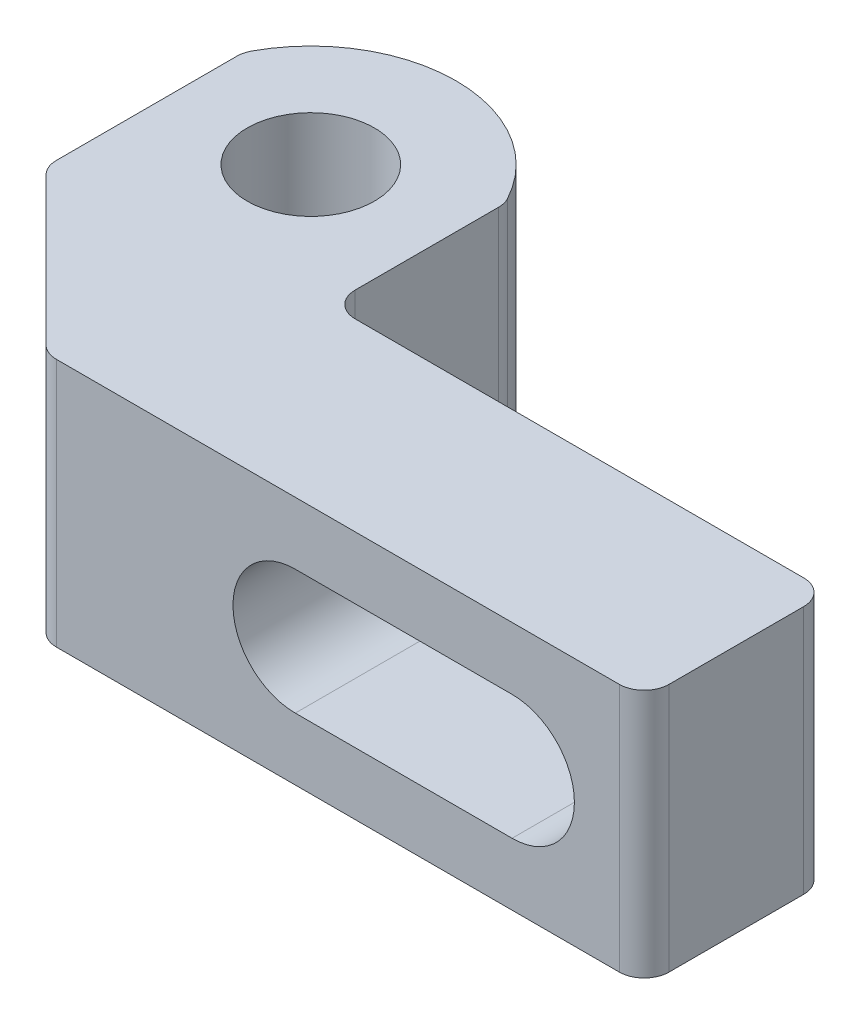
ISO-10303-21;
HEADER;
FILE_DESCRIPTION(('STEP AP214'),'2;1');
FILE_NAME('part.step','',(''),(''),'','','');
FILE_SCHEMA(('AUTOMOTIVE_DESIGN { 1 0 10303 214 1 1 1 1 }'));
ENDSEC;
DATA;
#1=APPLICATION_CONTEXT('core data for automotive mechanical design processes');
#2=APPLICATION_PROTOCOL_DEFINITION('international standard','automotive_design',2000,#1);
#3=PRODUCT_CONTEXT('',#1,'mechanical');
#4=PRODUCT('Part','Part','',(#3));
#5=PRODUCT_RELATED_PRODUCT_CATEGORY('part','',(#4));
#6=PRODUCT_DEFINITION_FORMATION('','',#4);
#7=PRODUCT_DEFINITION_CONTEXT('part definition',#1,'design');
#8=PRODUCT_DEFINITION('design','',#6,#7);
#9=PRODUCT_DEFINITION_SHAPE('','',#8);
#10=(LENGTH_UNIT() NAMED_UNIT(*) SI_UNIT(.MILLI.,.METRE.));
#11=(NAMED_UNIT(*) PLANE_ANGLE_UNIT() SI_UNIT($,.RADIAN.));
#12=(NAMED_UNIT(*) SI_UNIT($,.STERADIAN.) SOLID_ANGLE_UNIT());
#13=UNCERTAINTY_MEASURE_WITH_UNIT(LENGTH_MEASURE(1.E-05),#10,'distance_accuracy_value','');
#14=(GEOMETRIC_REPRESENTATION_CONTEXT(3) GLOBAL_UNCERTAINTY_ASSIGNED_CONTEXT((#13)) GLOBAL_UNIT_ASSIGNED_CONTEXT((#10,
#11,#12)) REPRESENTATION_CONTEXT('',''));
#15=CARTESIAN_POINT('',(0.,0.,0.));
#16=DIRECTION('',(0.,0.,1.));
#17=DIRECTION('',(1.,0.,0.));
#18=AXIS2_PLACEMENT_3D('',#15,#16,#17);
#19=CARTESIAN_POINT('',(-25.25,10.,-11.8738636363636));
#20=DIRECTION('',(0.,-1.,0.));
#21=DIRECTION('',(0.,0.,-1.));
#22=AXIS2_PLACEMENT_3D('',#19,#20,#21);
#23=PLANE('',#22);
#24=DIRECTION('',(0.707106781186546,0.,0.707106781186549));
#25=VECTOR('',#24,1.);
#26=CARTESIAN_POINT('',(-24.,10.,0.));
#27=LINE('',#26,#25);
#28=CARTESIAN_POINT('',(-30.2071067811865,10.,-6.20710678118656));
#29=VERTEX_POINT('',#28);
#30=CARTESIAN_POINT('',(-24.2928932188135,10.,-0.29289321881345));
#31=VERTEX_POINT('',#30);
#32=EDGE_CURVE('E226',#29,#31,#27,.T.);
#33=ORIENTED_EDGE('',*,*,#32,.T.);
#34=CARTESIAN_POINT('',(-23.5857864376269,10.,-0.999999999999997));
#35=DIRECTION('',(0.,-1.,0.));
#36=DIRECTION('',(0.,0.,-1.));
#37=AXIS2_PLACEMENT_3D('',#34,#35,#36);
#38=CIRCLE('',#37,1.);
#39=CARTESIAN_POINT('',(-23.5857864376269,10.,0.));
#40=VERTEX_POINT('',#39);
#41=EDGE_CURVE('E278',#31,#40,#38,.F.);
#42=ORIENTED_EDGE('',*,*,#41,.T.);
#43=DIRECTION('',(1.,0.,0.));
#44=VECTOR('',#43,1.);
#45=CARTESIAN_POINT('',(0.,10.,0.));
#46=LINE('',#45,#44);
#47=CARTESIAN_POINT('',(-1.,10.,0.));
#48=VERTEX_POINT('',#47);
#49=EDGE_CURVE('E209',#40,#48,#46,.T.);
#50=ORIENTED_EDGE('',*,*,#49,.T.);
#51=CARTESIAN_POINT('',(-1.,10.,-1.));
#52=DIRECTION('',(0.,-1.,0.));
#53=DIRECTION('',(0.,0.,-1.));
#54=AXIS2_PLACEMENT_3D('',#51,#52,#53);
#55=CIRCLE('',#54,1.);
#56=CARTESIAN_POINT('',(0.,10.,-1.));
#57=VERTEX_POINT('',#56);
#58=EDGE_CURVE('E269',#48,#57,#55,.F.);
#59=ORIENTED_EDGE('',*,*,#58,.T.);
#60=DIRECTION('',(0.,0.,-1.));
#61=VECTOR('',#60,1.);
#62=CARTESIAN_POINT('',(0.,10.,0.));
#63=LINE('',#62,#61);
#64=CARTESIAN_POINT('',(0.,10.,-6.4));
#65=VERTEX_POINT('',#64);
#66=EDGE_CURVE('E212',#57,#65,#63,.T.);
#67=ORIENTED_EDGE('',*,*,#66,.T.);
#68=CARTESIAN_POINT('',(-1.,10.,-6.4));
#69=DIRECTION('',(0.,-1.,0.));
#70=DIRECTION('',(0.,0.,-1.));
#71=AXIS2_PLACEMENT_3D('',#68,#69,#70);
#72=CIRCLE('',#71,1.);
#73=CARTESIAN_POINT('',(-1.,10.,-7.4));
#74=VERTEX_POINT('',#73);
#75=EDGE_CURVE('E271',#65,#74,#72,.F.);
#76=ORIENTED_EDGE('',*,*,#75,.T.);
#77=DIRECTION('',(-1.,0.,0.));
#78=VECTOR('',#77,1.);
#79=CARTESIAN_POINT('',(0.,10.,-7.4));
#80=LINE('',#79,#78);
#81=CARTESIAN_POINT('',(-19.,10.,-7.4));
#82=VERTEX_POINT('',#81);
#83=EDGE_CURVE('E216',#74,#82,#80,.T.);
#84=ORIENTED_EDGE('',*,*,#83,.T.);
#85=CARTESIAN_POINT('',(-19.,10.,-8.4));
#86=DIRECTION('',(0.,-1.,0.));
#87=DIRECTION('',(0.,0.,-1.));
#88=AXIS2_PLACEMENT_3D('',#85,#86,#87);
#89=CIRCLE('',#88,1.);
#90=CARTESIAN_POINT('',(-20.,10.,-8.4));
#91=VERTEX_POINT('',#90);
#92=EDGE_CURVE('E11',#82,#91,#89,.T.);
#93=ORIENTED_EDGE('',*,*,#92,.T.);
#94=DIRECTION('',(0.,0.,-1.));
#95=VECTOR('',#94,1.);
#96=CARTESIAN_POINT('',(-20.,10.,-7.4));
#97=LINE('',#96,#95);
#98=CARTESIAN_POINT('',(-20.,10.,-14.1605844764342));
#99=VERTEX_POINT('',#98);
#100=EDGE_CURVE('E219',#91,#99,#97,.T.);
#101=ORIENTED_EDGE('',*,*,#100,.T.);
#102=CARTESIAN_POINT('',(-21.,10.,-14.1605844764342));
#103=DIRECTION('',(0.,-1.,0.));
#104=DIRECTION('',(0.,0.,-1.));
#105=AXIS2_PLACEMENT_3D('',#102,#103,#104);
#106=CIRCLE('',#105,1.);
#107=CARTESIAN_POINT('',(-20.1193783847422,10.,-14.6344046646288));
#108=VERTEX_POINT('',#107);
#109=EDGE_CURVE('E273',#99,#108,#106,.F.);
#110=ORIENTED_EDGE('',*,*,#109,.T.);
#111=CARTESIAN_POINT('',(-25.25,10.,-11.8738636363636));
#112=DIRECTION('',(0.,1.,0.));
#113=DIRECTION('',(0.,0.,-1.));
#114=AXIS2_PLACEMENT_3D('',#111,#112,#113);
#115=CIRCLE('',#114,5.82613636363636);
#116=CARTESIAN_POINT('',(-30.3806216152578,10.,-14.6344046646288));
#117=VERTEX_POINT('',#116);
#118=EDGE_CURVE('E222',#108,#117,#115,.T.);
#119=ORIENTED_EDGE('',*,*,#118,.T.);
#120=CARTESIAN_POINT('',(-29.5,10.,-14.1605844764342));
#121=DIRECTION('',(0.,-1.,0.));
#122=DIRECTION('',(0.,0.,-1.));
#123=AXIS2_PLACEMENT_3D('',#120,#121,#122);
#124=CIRCLE('',#123,1.);
#125=CARTESIAN_POINT('',(-30.5,10.,-14.1605844764342));
#126=VERTEX_POINT('',#125);
#127=EDGE_CURVE('E55',#117,#126,#124,.F.);
#128=ORIENTED_EDGE('',*,*,#127,.T.);
#129=DIRECTION('',(0.,0.,1.));
#130=VECTOR('',#129,1.);
#131=CARTESIAN_POINT('',(-30.5,10.,-6.50000000000002));
#132=LINE('',#131,#130);
#133=CARTESIAN_POINT('',(-30.5,10.,-6.91421356237311));
#134=VERTEX_POINT('',#133);
#135=EDGE_CURVE('E224',#126,#134,#132,.T.);
#136=ORIENTED_EDGE('',*,*,#135,.T.);
#137=CARTESIAN_POINT('',(-29.5,10.,-6.91421356237311));
#138=DIRECTION('',(0.,-1.,0.));
#139=DIRECTION('',(0.,0.,-1.));
#140=AXIS2_PLACEMENT_3D('',#137,#138,#139);
#141=CIRCLE('',#140,1.);
#142=EDGE_CURVE('E276',#134,#29,#141,.F.);
#143=ORIENTED_EDGE('',*,*,#142,.T.);
#144=EDGE_LOOP('',(#33,#42,#50,#59,#67,#76,#84,#93,#101,#110,#119,#128,#136,#143));
#145=FACE_BOUND('',#144,.T.);
#146=CARTESIAN_POINT('',(-25.25,10.,-11.8738636363636));
#147=DIRECTION('',(0.,1.,0.));
#148=DIRECTION('',(0.,0.,1.));
#149=AXIS2_PLACEMENT_3D('',#146,#147,#148);
#150=CIRCLE('',#149,2.55);
#151=CARTESIAN_POINT('',(-25.25,10.,-9.32386363636364));
#152=VERTEX_POINT('',#151);
#153=EDGE_CURVE('E203',#152,#152,#150,.T.);
#154=ORIENTED_EDGE('',*,*,#153,.F.);
#155=EDGE_LOOP('',(#154));
#156=FACE_BOUND('',#155,.T.);
#157=ADVANCED_FACE('F33',(#145,#156),#23,.F.);
#158=CARTESIAN_POINT('',(-25.25,0.,-11.8738636363636));
#159=DIRECTION('',(0.,-1.,0.));
#160=DIRECTION('',(0.,0.,-1.));
#161=AXIS2_PLACEMENT_3D('',#158,#159,#160);
#162=PLANE('',#161);
#163=DIRECTION('',(1.,0.,0.));
#164=VECTOR('',#163,1.);
#165=CARTESIAN_POINT('',(0.,0.,0.));
#166=LINE('',#165,#164);
#167=CARTESIAN_POINT('',(-23.5857864376269,0.,0.));
#168=VERTEX_POINT('',#167);
#169=CARTESIAN_POINT('',(-1.,0.,0.));
#170=VERTEX_POINT('',#169);
#171=EDGE_CURVE('E206',#168,#170,#166,.T.);
#172=ORIENTED_EDGE('',*,*,#171,.F.);
#173=CARTESIAN_POINT('',(-23.5857864376269,0.,-0.999999999999997));
#174=DIRECTION('',(0.,-1.,0.));
#175=DIRECTION('',(0.,0.,-1.));
#176=AXIS2_PLACEMENT_3D('',#173,#174,#175);
#177=CIRCLE('',#176,1.);
#178=CARTESIAN_POINT('',(-24.2928932188135,0.,-0.29289321881345));
#179=VERTEX_POINT('',#178);
#180=EDGE_CURVE('E262',#168,#179,#177,.T.);
#181=ORIENTED_EDGE('',*,*,#180,.T.);
#182=DIRECTION('',(0.707106781186546,0.,0.707106781186549));
#183=VECTOR('',#182,1.);
#184=CARTESIAN_POINT('',(-24.,0.,0.));
#185=LINE('',#184,#183);
#186=CARTESIAN_POINT('',(-30.2071067811865,0.,-6.20710678118656));
#187=VERTEX_POINT('',#186);
#188=EDGE_CURVE('E213',#187,#179,#185,.T.);
#189=ORIENTED_EDGE('',*,*,#188,.F.);
#190=CARTESIAN_POINT('',(-29.5,0.,-6.91421356237311));
#191=DIRECTION('',(0.,-1.,0.));
#192=DIRECTION('',(0.,0.,-1.));
#193=AXIS2_PLACEMENT_3D('',#190,#191,#192);
#194=CIRCLE('',#193,1.);
#195=CARTESIAN_POINT('',(-30.5,0.,-6.91421356237311));
#196=VERTEX_POINT('',#195);
#197=EDGE_CURVE('E260',#187,#196,#194,.T.);
#198=ORIENTED_EDGE('',*,*,#197,.T.);
#199=DIRECTION('',(0.,0.,1.));
#200=VECTOR('',#199,1.);
#201=CARTESIAN_POINT('',(-30.5,0.,-6.50000000000002));
#202=LINE('',#201,#200);
#203=CARTESIAN_POINT('',(-30.5,0.,-14.1605844764342));
#204=VERTEX_POINT('',#203);
#205=EDGE_CURVE('E244',#204,#196,#202,.T.);
#206=ORIENTED_EDGE('',*,*,#205,.F.);
#207=CARTESIAN_POINT('',(-29.5,0.,-14.1605844764342));
#208=DIRECTION('',(0.,-1.,0.));
#209=DIRECTION('',(0.,0.,-1.));
#210=AXIS2_PLACEMENT_3D('',#207,#208,#209);
#211=CIRCLE('',#210,1.);
#212=CARTESIAN_POINT('',(-30.3806216152578,0.,-14.6344046646288));
#213=VERTEX_POINT('',#212);
#214=EDGE_CURVE('E258',#204,#213,#211,.T.);
#215=ORIENTED_EDGE('',*,*,#214,.T.);
#216=CARTESIAN_POINT('',(-25.25,0.,-11.8738636363636));
#217=DIRECTION('',(0.,1.,0.));
#218=DIRECTION('',(0.,0.,-1.));
#219=AXIS2_PLACEMENT_3D('',#216,#217,#218);
#220=CIRCLE('',#219,5.82613636363636);
#221=CARTESIAN_POINT('',(-20.1193783847422,0.,-14.6344046646288));
#222=VERTEX_POINT('',#221);
#223=EDGE_CURVE('E241',#222,#213,#220,.T.);
#224=ORIENTED_EDGE('',*,*,#223,.F.);
#225=CARTESIAN_POINT('',(-21.,0.,-14.1605844764342));
#226=DIRECTION('',(0.,-1.,0.));
#227=DIRECTION('',(0.,0.,-1.));
#228=AXIS2_PLACEMENT_3D('',#225,#226,#227);
#229=CIRCLE('',#228,1.);
#230=CARTESIAN_POINT('',(-20.,0.,-14.1605844764342));
#231=VERTEX_POINT('',#230);
#232=EDGE_CURVE('E256',#222,#231,#229,.T.);
#233=ORIENTED_EDGE('',*,*,#232,.T.);
#234=DIRECTION('',(0.,0.,-1.));
#235=VECTOR('',#234,1.);
#236=CARTESIAN_POINT('',(-20.,0.,-7.4));
#237=LINE('',#236,#235);
#238=CARTESIAN_POINT('',(-20.,0.,-8.4));
#239=VERTEX_POINT('',#238);
#240=EDGE_CURVE('E238',#239,#231,#237,.T.);
#241=ORIENTED_EDGE('',*,*,#240,.F.);
#242=CARTESIAN_POINT('',(-19.,0.,-8.4));
#243=DIRECTION('',(0.,-1.,0.));
#244=DIRECTION('',(0.,0.,-1.));
#245=AXIS2_PLACEMENT_3D('',#242,#243,#244);
#246=CIRCLE('',#245,1.);
#247=CARTESIAN_POINT('',(-19.,0.,-7.4));
#248=VERTEX_POINT('',#247);
#249=EDGE_CURVE('E41',#239,#248,#246,.F.);
#250=ORIENTED_EDGE('',*,*,#249,.T.);
#251=DIRECTION('',(-1.,0.,0.));
#252=VECTOR('',#251,1.);
#253=CARTESIAN_POINT('',(0.,0.,-7.4));
#254=LINE('',#253,#252);
#255=CARTESIAN_POINT('',(-1.,0.,-7.4));
#256=VERTEX_POINT('',#255);
#257=EDGE_CURVE('E235',#256,#248,#254,.T.);
#258=ORIENTED_EDGE('',*,*,#257,.F.);
#259=CARTESIAN_POINT('',(-1.,0.,-6.4));
#260=DIRECTION('',(0.,-1.,0.));
#261=DIRECTION('',(0.,0.,-1.));
#262=AXIS2_PLACEMENT_3D('',#259,#260,#261);
#263=CIRCLE('',#262,1.);
#264=CARTESIAN_POINT('',(0.,0.,-6.4));
#265=VERTEX_POINT('',#264);
#266=EDGE_CURVE('E254',#256,#265,#263,.T.);
#267=ORIENTED_EDGE('',*,*,#266,.T.);
#268=DIRECTION('',(0.,0.,-1.));
#269=VECTOR('',#268,1.);
#270=CARTESIAN_POINT('',(0.,0.,0.));
#271=LINE('',#270,#269);
#272=CARTESIAN_POINT('',(0.,0.,-1.));
#273=VERTEX_POINT('',#272);
#274=EDGE_CURVE('E232',#273,#265,#271,.T.);
#275=ORIENTED_EDGE('',*,*,#274,.F.);
#276=CARTESIAN_POINT('',(-1.,0.,-1.));
#277=DIRECTION('',(0.,-1.,0.));
#278=DIRECTION('',(0.,0.,-1.));
#279=AXIS2_PLACEMENT_3D('',#276,#277,#278);
#280=CIRCLE('',#279,1.);
#281=EDGE_CURVE('E252',#273,#170,#280,.T.);
#282=ORIENTED_EDGE('',*,*,#281,.T.);
#283=EDGE_LOOP('',(#172,#181,#189,#198,#206,#215,#224,#233,#241,#250,#258,#267,#275,#282));
#284=FACE_BOUND('',#283,.T.);
#285=CARTESIAN_POINT('',(-25.25,0.,-11.8738636363636));
#286=DIRECTION('',(0.,1.,0.));
#287=DIRECTION('',(0.,0.,1.));
#288=AXIS2_PLACEMENT_3D('',#285,#286,#287);
#289=CIRCLE('',#288,2.55);
#290=CARTESIAN_POINT('',(-25.25,0.,-9.32386363636364));
#291=VERTEX_POINT('',#290);
#292=EDGE_CURVE('E199',#291,#291,#289,.T.);
#293=ORIENTED_EDGE('',*,*,#292,.T.);
#294=EDGE_LOOP('',(#293));
#295=FACE_BOUND('',#294,.T.);
#296=ADVANCED_FACE('F307',(#284,#295),#162,.T.);
#297=CARTESIAN_POINT('',(0.,10.,0.));
#298=DIRECTION('',(0.,0.,-1.));
#299=DIRECTION('',(-1.,0.,0.));
#300=AXIS2_PLACEMENT_3D('',#297,#298,#299);
#301=PLANE('',#300);
#302=DIRECTION('',(-1.,0.,0.));
#303=VECTOR('',#302,1.);
#304=CARTESIAN_POINT('',(-14.,2.5,0.));
#305=LINE('',#304,#303);
#306=CARTESIAN_POINT('',(-5.3,2.5,0.));
#307=VERTEX_POINT('',#306);
#308=CARTESIAN_POINT('',(-14.,2.5,0.));
#309=VERTEX_POINT('',#308);
#310=EDGE_CURVE('E171',#307,#309,#305,.T.);
#311=ORIENTED_EDGE('',*,*,#310,.T.);
#312=CARTESIAN_POINT('',(-14.,5.,0.));
#313=DIRECTION('',(0.,0.,-1.));
#314=DIRECTION('',(-1.,0.,0.));
#315=AXIS2_PLACEMENT_3D('',#312,#313,#314);
#316=CIRCLE('',#315,2.5);
#317=CARTESIAN_POINT('',(-14.,7.5,0.));
#318=VERTEX_POINT('',#317);
#319=EDGE_CURVE('E163',#309,#318,#316,.T.);
#320=ORIENTED_EDGE('',*,*,#319,.T.);
#321=DIRECTION('',(1.,0.,0.));
#322=VECTOR('',#321,1.);
#323=CARTESIAN_POINT('',(-14.,7.5,0.));
#324=LINE('',#323,#322);
#325=CARTESIAN_POINT('',(-5.3,7.5,0.));
#326=VERTEX_POINT('',#325);
#327=EDGE_CURVE('E175',#318,#326,#324,.T.);
#328=ORIENTED_EDGE('',*,*,#327,.T.);
#329=CARTESIAN_POINT('',(-5.3,5.,0.));
#330=DIRECTION('',(0.,0.,-1.));
#331=DIRECTION('',(-1.,0.,0.));
#332=AXIS2_PLACEMENT_3D('',#329,#330,#331);
#333=CIRCLE('',#332,2.5);
#334=EDGE_CURVE('E179',#326,#307,#333,.T.);
#335=ORIENTED_EDGE('',*,*,#334,.T.);
#336=EDGE_LOOP('',(#311,#320,#328,#335));
#337=FACE_BOUND('',#336,.T.);
#338=ORIENTED_EDGE('',*,*,#49,.F.);
#339=DIRECTION('',(0.,-1.,0.));
#340=VECTOR('',#339,1.);
#341=CARTESIAN_POINT('',(-23.5857864376269,10.,0.));
#342=LINE('',#341,#340);
#343=EDGE_CURVE('E249',#40,#168,#342,.T.);
#344=ORIENTED_EDGE('',*,*,#343,.T.);
#345=ORIENTED_EDGE('',*,*,#171,.T.);
#346=DIRECTION('',(0.,-1.,0.));
#347=VECTOR('',#346,1.);
#348=CARTESIAN_POINT('',(-1.,10.,0.));
#349=LINE('',#348,#347);
#350=EDGE_CURVE('E229',#170,#48,#349,.F.);
#351=ORIENTED_EDGE('',*,*,#350,.T.);
#352=EDGE_LOOP('',(#338,#344,#345,#351));
#353=FACE_BOUND('',#352,.T.);
#354=ADVANCED_FACE('F181',(#337,#353),#301,.F.);
#355=CARTESIAN_POINT('',(0.,10.,0.));
#356=DIRECTION('',(-1.,0.,0.));
#357=DIRECTION('',(0.,0.,1.));
#358=AXIS2_PLACEMENT_3D('',#355,#356,#357);
#359=PLANE('',#358);
#360=ORIENTED_EDGE('',*,*,#274,.T.);
#361=DIRECTION('',(0.,-1.,0.));
#362=VECTOR('',#361,1.);
#363=CARTESIAN_POINT('',(0.,10.,-6.4));
#364=LINE('',#363,#362);
#365=EDGE_CURVE('E302',#265,#65,#364,.F.);
#366=ORIENTED_EDGE('',*,*,#365,.T.);
#367=ORIENTED_EDGE('',*,*,#66,.F.);
#368=DIRECTION('',(0.,-1.,0.));
#369=VECTOR('',#368,1.);
#370=CARTESIAN_POINT('',(0.,10.,-1.));
#371=LINE('',#370,#369);
#372=EDGE_CURVE('E299',#57,#273,#371,.T.);
#373=ORIENTED_EDGE('',*,*,#372,.T.);
#374=EDGE_LOOP('',(#360,#366,#367,#373));
#375=FACE_BOUND('',#374,.T.);
#376=ADVANCED_FACE('F358',(#375),#359,.F.);
#377=CARTESIAN_POINT('',(0.,10.,-7.4));
#378=DIRECTION('',(0.,0.,1.));
#379=DIRECTION('',(1.,0.,0.));
#380=AXIS2_PLACEMENT_3D('',#377,#378,#379);
#381=PLANE('',#380);
#382=DIRECTION('',(1.,0.,0.));
#383=VECTOR('',#382,1.);
#384=CARTESIAN_POINT('',(-14.,7.5,-7.4));
#385=LINE('',#384,#383);
#386=CARTESIAN_POINT('',(-14.,7.5,-7.4));
#387=VERTEX_POINT('',#386);
#388=CARTESIAN_POINT('',(-5.3,7.5,-7.4));
#389=VERTEX_POINT('',#388);
#390=EDGE_CURVE('E193',#387,#389,#385,.T.);
#391=ORIENTED_EDGE('',*,*,#390,.F.);
#392=CARTESIAN_POINT('',(-14.,5.,-7.4));
#393=DIRECTION('',(0.,0.,-1.));
#394=DIRECTION('',(-1.,0.,0.));
#395=AXIS2_PLACEMENT_3D('',#392,#393,#394);
#396=CIRCLE('',#395,2.5);
#397=CARTESIAN_POINT('',(-14.,2.5,-7.4));
#398=VERTEX_POINT('',#397);
#399=EDGE_CURVE('E166',#398,#387,#396,.T.);
#400=ORIENTED_EDGE('',*,*,#399,.F.);
#401=DIRECTION('',(-1.,0.,0.));
#402=VECTOR('',#401,1.);
#403=CARTESIAN_POINT('',(-14.,2.5,-7.4));
#404=LINE('',#403,#402);
#405=CARTESIAN_POINT('',(-5.3,2.5,-7.4));
#406=VERTEX_POINT('',#405);
#407=EDGE_CURVE('E184',#406,#398,#404,.T.);
#408=ORIENTED_EDGE('',*,*,#407,.F.);
#409=CARTESIAN_POINT('',(-5.3,5.,-7.4));
#410=DIRECTION('',(0.,0.,-1.));
#411=DIRECTION('',(-1.,0.,0.));
#412=AXIS2_PLACEMENT_3D('',#409,#410,#411);
#413=CIRCLE('',#412,2.5);
#414=EDGE_CURVE('E187',#389,#406,#413,.T.);
#415=ORIENTED_EDGE('',*,*,#414,.F.);
#416=EDGE_LOOP('',(#391,#400,#408,#415));
#417=FACE_BOUND('',#416,.T.);
#418=ORIENTED_EDGE('',*,*,#257,.T.);
#419=DIRECTION('',(0.,-1.,0.));
#420=VECTOR('',#419,1.);
#421=CARTESIAN_POINT('',(-19.,10.,-7.4));
#422=LINE('',#421,#420);
#423=EDGE_CURVE('E297',#248,#82,#422,.F.);
#424=ORIENTED_EDGE('',*,*,#423,.T.);
#425=ORIENTED_EDGE('',*,*,#83,.F.);
#426=DIRECTION('',(0.,-1.,0.));
#427=VECTOR('',#426,1.);
#428=CARTESIAN_POINT('',(-1.,10.,-7.4));
#429=LINE('',#428,#427);
#430=EDGE_CURVE('E294',#74,#256,#429,.T.);
#431=ORIENTED_EDGE('',*,*,#430,.T.);
#432=EDGE_LOOP('',(#418,#424,#425,#431));
#433=FACE_BOUND('',#432,.T.);
#434=ADVANCED_FACE('F313',(#417,#433),#381,.F.);
#435=CARTESIAN_POINT('',(-20.,10.,-7.4));
#436=DIRECTION('',(-1.,0.,0.));
#437=DIRECTION('',(0.,0.,1.));
#438=AXIS2_PLACEMENT_3D('',#435,#436,#437);
#439=PLANE('',#438);
#440=ORIENTED_EDGE('',*,*,#240,.T.);
#441=DIRECTION('',(0.,-1.,0.));
#442=VECTOR('',#441,1.);
#443=CARTESIAN_POINT('',(-20.,10.,-14.1605844764342));
#444=LINE('',#443,#442);
#445=EDGE_CURVE('E292',#231,#99,#444,.F.);
#446=ORIENTED_EDGE('',*,*,#445,.T.);
#447=ORIENTED_EDGE('',*,*,#100,.F.);
#448=DIRECTION('',(0.,-1.,0.));
#449=VECTOR('',#448,1.);
#450=CARTESIAN_POINT('',(-20.,0.,-8.4));
#451=LINE('',#450,#449);
#452=EDGE_CURVE('E289',#91,#239,#451,.T.);
#453=ORIENTED_EDGE('',*,*,#452,.T.);
#454=EDGE_LOOP('',(#440,#446,#447,#453));
#455=FACE_BOUND('',#454,.T.);
#456=ADVANCED_FACE('F322',(#455),#439,.F.);
#457=CARTESIAN_POINT('',(-25.25,10.,-11.8738636363636));
#458=DIRECTION('',(0.,-1.,0.));
#459=DIRECTION('',(0.,0.,-1.));
#460=AXIS2_PLACEMENT_3D('',#457,#458,#459);
#461=CYLINDRICAL_SURFACE('',#460,5.82613636363636);
#462=ORIENTED_EDGE('',*,*,#223,.T.);
#463=DIRECTION('',(0.,-1.,0.));
#464=VECTOR('',#463,1.);
#465=CARTESIAN_POINT('',(-30.3806216152578,10.,-14.6344046646288));
#466=LINE('',#465,#464);
#467=EDGE_CURVE('E287',#213,#117,#466,.F.);
#468=ORIENTED_EDGE('',*,*,#467,.T.);
#469=ORIENTED_EDGE('',*,*,#118,.F.);
#470=DIRECTION('',(0.,-1.,0.));
#471=VECTOR('',#470,1.);
#472=CARTESIAN_POINT('',(-20.1193783847422,10.,-14.6344046646288));
#473=LINE('',#472,#471);
#474=EDGE_CURVE('E284',#108,#222,#473,.T.);
#475=ORIENTED_EDGE('',*,*,#474,.T.);
#476=EDGE_LOOP('',(#462,#468,#469,#475));
#477=FACE_BOUND('',#476,.T.);
#478=ADVANCED_FACE('F329',(#477),#461,.T.);
#479=CARTESIAN_POINT('',(-30.5,10.,-6.50000000000002));
#480=DIRECTION('',(1.,0.,0.));
#481=DIRECTION('',(0.,0.,-1.));
#482=AXIS2_PLACEMENT_3D('',#479,#480,#481);
#483=PLANE('',#482);
#484=ORIENTED_EDGE('',*,*,#205,.T.);
#485=DIRECTION('',(0.,-1.,0.));
#486=VECTOR('',#485,1.);
#487=CARTESIAN_POINT('',(-30.5,10.,-6.91421356237311));
#488=LINE('',#487,#486);
#489=EDGE_CURVE('E48',#196,#134,#488,.F.);
#490=ORIENTED_EDGE('',*,*,#489,.T.);
#491=ORIENTED_EDGE('',*,*,#135,.F.);
#492=DIRECTION('',(0.,-1.,0.));
#493=VECTOR('',#492,1.);
#494=CARTESIAN_POINT('',(-30.5,10.,-14.1605844764342));
#495=LINE('',#494,#493);
#496=EDGE_CURVE('E280',#126,#204,#495,.T.);
#497=ORIENTED_EDGE('',*,*,#496,.T.);
#498=EDGE_LOOP('',(#484,#490,#491,#497));
#499=FACE_BOUND('',#498,.T.);
#500=ADVANCED_FACE('F336',(#499),#483,.F.);
#501=CARTESIAN_POINT('',(-24.,10.,0.));
#502=DIRECTION('',(0.707106781186549,0.,-0.707106781186546));
#503=DIRECTION('',(-0.707106781186546,0.,-0.707106781186549));
#504=AXIS2_PLACEMENT_3D('',#501,#502,#503);
#505=PLANE('',#504);
#506=ORIENTED_EDGE('',*,*,#188,.T.);
#507=DIRECTION('',(0.,-1.,0.));
#508=VECTOR('',#507,1.);
#509=CARTESIAN_POINT('',(-24.2928932188135,10.,-0.292893218813451));
#510=LINE('',#509,#508);
#511=EDGE_CURVE('E267',#179,#31,#510,.F.);
#512=ORIENTED_EDGE('',*,*,#511,.T.);
#513=ORIENTED_EDGE('',*,*,#32,.F.);
#514=DIRECTION('',(0.,-1.,0.));
#515=VECTOR('',#514,1.);
#516=CARTESIAN_POINT('',(-30.2071067811865,10.,-6.20710678118656));
#517=LINE('',#516,#515);
#518=EDGE_CURVE('E264',#29,#187,#517,.T.);
#519=ORIENTED_EDGE('',*,*,#518,.T.);
#520=EDGE_LOOP('',(#506,#512,#513,#519));
#521=FACE_BOUND('',#520,.T.);
#522=ADVANCED_FACE('F344',(#521),#505,.F.);
#523=CARTESIAN_POINT('',(-25.25,10.,-11.8738636363636));
#524=DIRECTION('',(0.,-1.,0.));
#525=DIRECTION('',(0.,0.,-1.));
#526=AXIS2_PLACEMENT_3D('',#523,#524,#525);
#527=CYLINDRICAL_SURFACE('',#526,2.55);
#528=ORIENTED_EDGE('',*,*,#153,.T.);
#529=EDGE_LOOP('',(#528));
#530=FACE_BOUND('',#529,.T.);
#531=ORIENTED_EDGE('',*,*,#292,.F.);
#532=EDGE_LOOP('',(#531));
#533=FACE_BOUND('',#532,.T.);
#534=ADVANCED_FACE('F376',(#530,#533),#527,.F.);
#535=CARTESIAN_POINT('',(-14.,5.,0.));
#536=DIRECTION('',(0.,0.,-1.));
#537=DIRECTION('',(-1.,0.,0.));
#538=AXIS2_PLACEMENT_3D('',#535,#536,#537);
#539=CYLINDRICAL_SURFACE('',#538,2.5);
#540=ORIENTED_EDGE('',*,*,#399,.T.);
#541=DIRECTION('',(0.,0.,-1.));
#542=VECTOR('',#541,1.);
#543=CARTESIAN_POINT('',(-14.,7.5,0.));
#544=LINE('',#543,#542);
#545=EDGE_CURVE('E159',#318,#387,#544,.T.);
#546=ORIENTED_EDGE('',*,*,#545,.F.);
#547=ORIENTED_EDGE('',*,*,#319,.F.);
#548=DIRECTION('',(0.,0.,-1.));
#549=VECTOR('',#548,1.);
#550=CARTESIAN_POINT('',(-14.,2.5,0.));
#551=LINE('',#550,#549);
#552=EDGE_CURVE('E197',#309,#398,#551,.T.);
#553=ORIENTED_EDGE('',*,*,#552,.T.);
#554=EDGE_LOOP('',(#540,#546,#547,#553));
#555=FACE_BOUND('',#554,.T.);
#556=ADVANCED_FACE('F161',(#555),#539,.F.);
#557=CARTESIAN_POINT('',(-14.,2.5,0.));
#558=DIRECTION('',(0.,-1.,0.));
#559=DIRECTION('',(1.,0.,0.));
#560=AXIS2_PLACEMENT_3D('',#557,#558,#559);
#561=PLANE('',#560);
#562=ORIENTED_EDGE('',*,*,#407,.T.);
#563=ORIENTED_EDGE('',*,*,#552,.F.);
#564=ORIENTED_EDGE('',*,*,#310,.F.);
#565=DIRECTION('',(0.,0.,-1.));
#566=VECTOR('',#565,1.);
#567=CARTESIAN_POINT('',(-5.3,2.5,0.));
#568=LINE('',#567,#566);
#569=EDGE_CURVE('E200',#307,#406,#568,.T.);
#570=ORIENTED_EDGE('',*,*,#569,.T.);
#571=EDGE_LOOP('',(#562,#563,#564,#570));
#572=FACE_BOUND('',#571,.T.);
#573=ADVANCED_FACE('F454',(#572),#561,.F.);
#574=CARTESIAN_POINT('',(-5.3,5.,0.));
#575=DIRECTION('',(0.,0.,-1.));
#576=DIRECTION('',(-1.,0.,0.));
#577=AXIS2_PLACEMENT_3D('',#574,#575,#576);
#578=CYLINDRICAL_SURFACE('',#577,2.5);
#579=ORIENTED_EDGE('',*,*,#414,.T.);
#580=ORIENTED_EDGE('',*,*,#569,.F.);
#581=ORIENTED_EDGE('',*,*,#334,.F.);
#582=DIRECTION('',(0.,0.,-1.));
#583=VECTOR('',#582,1.);
#584=CARTESIAN_POINT('',(-5.3,7.5,0.));
#585=LINE('',#584,#583);
#586=EDGE_CURVE('E170',#326,#389,#585,.T.);
#587=ORIENTED_EDGE('',*,*,#586,.T.);
#588=EDGE_LOOP('',(#579,#580,#581,#587));
#589=FACE_BOUND('',#588,.T.);
#590=ADVANCED_FACE('F446',(#589),#578,.F.);
#591=CARTESIAN_POINT('',(-14.,7.5,0.));
#592=DIRECTION('',(0.,1.,0.));
#593=DIRECTION('',(0.,0.,1.));
#594=AXIS2_PLACEMENT_3D('',#591,#592,#593);
#595=PLANE('',#594);
#596=ORIENTED_EDGE('',*,*,#390,.T.);
#597=ORIENTED_EDGE('',*,*,#586,.F.);
#598=ORIENTED_EDGE('',*,*,#327,.F.);
#599=ORIENTED_EDGE('',*,*,#545,.T.);
#600=EDGE_LOOP('',(#596,#597,#598,#599));
#601=FACE_BOUND('',#600,.T.);
#602=ADVANCED_FACE('F176',(#601),#595,.F.);
#603=CARTESIAN_POINT('',(-23.5857864376269,10.,-0.999999999999997));
#604=DIRECTION('',(0.,-1.,0.));
#605=DIRECTION('',(0.,0.,-1.));
#606=AXIS2_PLACEMENT_3D('',#603,#604,#605);
#607=CYLINDRICAL_SURFACE('',#606,1.);
#608=ORIENTED_EDGE('',*,*,#41,.F.);
#609=ORIENTED_EDGE('',*,*,#511,.F.);
#610=ORIENTED_EDGE('',*,*,#180,.F.);
#611=ORIENTED_EDGE('',*,*,#343,.F.);
#612=EDGE_LOOP('',(#608,#609,#610,#611));
#613=FACE_BOUND('',#612,.T.);
#614=ADVANCED_FACE('F350',(#613),#607,.T.);
#615=CARTESIAN_POINT('',(-29.5,10.,-6.91421356237311));
#616=DIRECTION('',(0.,-1.,0.));
#617=DIRECTION('',(0.,0.,-1.));
#618=AXIS2_PLACEMENT_3D('',#615,#616,#617);
#619=CYLINDRICAL_SURFACE('',#618,1.);
#620=ORIENTED_EDGE('',*,*,#142,.F.);
#621=ORIENTED_EDGE('',*,*,#489,.F.);
#622=ORIENTED_EDGE('',*,*,#197,.F.);
#623=ORIENTED_EDGE('',*,*,#518,.F.);
#624=EDGE_LOOP('',(#620,#621,#622,#623));
#625=FACE_BOUND('',#624,.T.);
#626=ADVANCED_FACE('F341',(#625),#619,.T.);
#627=CARTESIAN_POINT('',(-29.5,10.,-14.1605844764342));
#628=DIRECTION('',(0.,-1.,0.));
#629=DIRECTION('',(0.,0.,-1.));
#630=AXIS2_PLACEMENT_3D('',#627,#628,#629);
#631=CYLINDRICAL_SURFACE('',#630,1.);
#632=ORIENTED_EDGE('',*,*,#127,.F.);
#633=ORIENTED_EDGE('',*,*,#467,.F.);
#634=ORIENTED_EDGE('',*,*,#214,.F.);
#635=ORIENTED_EDGE('',*,*,#496,.F.);
#636=EDGE_LOOP('',(#632,#633,#634,#635));
#637=FACE_BOUND('',#636,.T.);
#638=ADVANCED_FACE('F333',(#637),#631,.T.);
#639=CARTESIAN_POINT('',(-21.,10.,-14.1605844764342));
#640=DIRECTION('',(0.,-1.,0.));
#641=DIRECTION('',(0.,0.,-1.));
#642=AXIS2_PLACEMENT_3D('',#639,#640,#641);
#643=CYLINDRICAL_SURFACE('',#642,1.);
#644=ORIENTED_EDGE('',*,*,#109,.F.);
#645=ORIENTED_EDGE('',*,*,#445,.F.);
#646=ORIENTED_EDGE('',*,*,#232,.F.);
#647=ORIENTED_EDGE('',*,*,#474,.F.);
#648=EDGE_LOOP('',(#644,#645,#646,#647));
#649=FACE_BOUND('',#648,.T.);
#650=ADVANCED_FACE('F325',(#649),#643,.T.);
#651=CARTESIAN_POINT('',(-19.,10.,-8.4));
#652=DIRECTION('',(0.,1.,0.));
#653=DIRECTION('',(0.,0.,1.));
#654=AXIS2_PLACEMENT_3D('',#651,#652,#653);
#655=CYLINDRICAL_SURFACE('',#654,1.);
#656=ORIENTED_EDGE('',*,*,#92,.F.);
#657=ORIENTED_EDGE('',*,*,#423,.F.);
#658=ORIENTED_EDGE('',*,*,#249,.F.);
#659=ORIENTED_EDGE('',*,*,#452,.F.);
#660=EDGE_LOOP('',(#656,#657,#658,#659));
#661=FACE_BOUND('',#660,.T.);
#662=ADVANCED_FACE('F317',(#661),#655,.F.);
#663=CARTESIAN_POINT('',(-1.,10.,-6.4));
#664=DIRECTION('',(0.,-1.,0.));
#665=DIRECTION('',(0.,0.,-1.));
#666=AXIS2_PLACEMENT_3D('',#663,#664,#665);
#667=CYLINDRICAL_SURFACE('',#666,1.);
#668=ORIENTED_EDGE('',*,*,#75,.F.);
#669=ORIENTED_EDGE('',*,*,#365,.F.);
#670=ORIENTED_EDGE('',*,*,#266,.F.);
#671=ORIENTED_EDGE('',*,*,#430,.F.);
#672=EDGE_LOOP('',(#668,#669,#670,#671));
#673=FACE_BOUND('',#672,.T.);
#674=ADVANCED_FACE('F362',(#673),#667,.T.);
#675=CARTESIAN_POINT('',(-1.,10.,-1.));
#676=DIRECTION('',(0.,-1.,0.));
#677=DIRECTION('',(0.,0.,-1.));
#678=AXIS2_PLACEMENT_3D('',#675,#676,#677);
#679=CYLINDRICAL_SURFACE('',#678,1.);
#680=ORIENTED_EDGE('',*,*,#58,.F.);
#681=ORIENTED_EDGE('',*,*,#350,.F.);
#682=ORIENTED_EDGE('',*,*,#281,.F.);
#683=ORIENTED_EDGE('',*,*,#372,.F.);
#684=EDGE_LOOP('',(#680,#681,#682,#683));
#685=FACE_BOUND('',#684,.T.);
#686=ADVANCED_FACE('F35',(#685),#679,.T.);
#687=CLOSED_SHELL('',(#157,#296,#354,#376,#434,#456,#478,#500,#522,#534,#556,#573,#590,#602,
#614,#626,#638,#650,#662,#674,#686));
#688=MANIFOLD_SOLID_BREP('B2',#687);
#689=ADVANCED_BREP_SHAPE_REPRESENTATION('',(#18,#688),#14);
#690=SHAPE_DEFINITION_REPRESENTATION(#9,#689);
ENDSEC;
END-ISO-10303-21;
